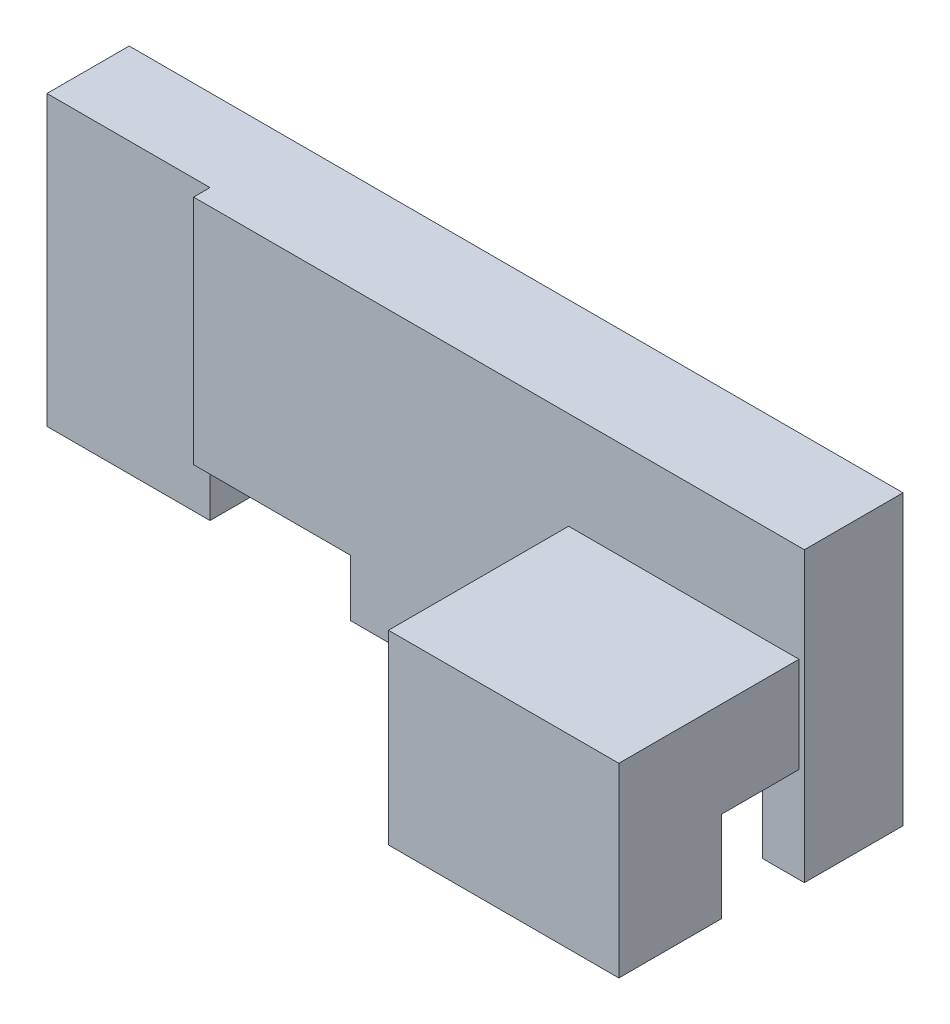
ISO-10303-21;
HEADER;
FILE_DESCRIPTION(('STEP AP214'),'2;1');
FILE_NAME('part.step','',(''),(''),'','','');
FILE_SCHEMA(('AUTOMOTIVE_DESIGN { 1 0 10303 214 1 1 1 1 }'));
ENDSEC;
DATA;
#1=APPLICATION_CONTEXT('core data for automotive mechanical design processes');
#2=APPLICATION_PROTOCOL_DEFINITION('international standard','automotive_design',2000,#1);
#3=PRODUCT_CONTEXT('',#1,'mechanical');
#4=PRODUCT('Part','Part','',(#3));
#5=PRODUCT_RELATED_PRODUCT_CATEGORY('part','',(#4));
#6=PRODUCT_DEFINITION_FORMATION('','',#4);
#7=PRODUCT_DEFINITION_CONTEXT('part definition',#1,'design');
#8=PRODUCT_DEFINITION('design','',#6,#7);
#9=PRODUCT_DEFINITION_SHAPE('','',#8);
#10=(LENGTH_UNIT() NAMED_UNIT(*) SI_UNIT(.MILLI.,.METRE.));
#11=(NAMED_UNIT(*) PLANE_ANGLE_UNIT() SI_UNIT($,.RADIAN.));
#12=(NAMED_UNIT(*) SI_UNIT($,.STERADIAN.) SOLID_ANGLE_UNIT());
#13=UNCERTAINTY_MEASURE_WITH_UNIT(LENGTH_MEASURE(1.E-05),#10,'distance_accuracy_value','');
#14=(GEOMETRIC_REPRESENTATION_CONTEXT(3) GLOBAL_UNCERTAINTY_ASSIGNED_CONTEXT((#13)) GLOBAL_UNIT_ASSIGNED_CONTEXT((#10,
#11,#12)) REPRESENTATION_CONTEXT('',''));
#15=CARTESIAN_POINT('',(0.,0.,0.));
#16=DIRECTION('',(0.,0.,1.));
#17=DIRECTION('',(1.,0.,0.));
#18=AXIS2_PLACEMENT_3D('',#15,#16,#17);
#19=CARTESIAN_POINT('',(1120.75,-651.999999999999,710.));
#20=DIRECTION('',(0.,0.,-1.));
#21=DIRECTION('',(-1.,0.,0.));
#22=AXIS2_PLACEMENT_3D('',#19,#20,#21);
#23=PLANE('',#22);
#24=DIRECTION('',(0.,1.,0.));
#25=VECTOR('',#24,1.);
#26=CARTESIAN_POINT('',(1120.75,-651.999999999999,710.));
#27=LINE('',#26,#25);
#28=CARTESIAN_POINT('',(1120.75,-651.999999999999,710.));
#29=VERTEX_POINT('',#28);
#30=CARTESIAN_POINT('',(1120.75,-316.231627321212,710.));
#31=VERTEX_POINT('',#30);
#32=EDGE_CURVE('E58',#29,#31,#27,.T.);
#33=ORIENTED_EDGE('',*,*,#32,.T.);
#34=DIRECTION('',(1.,0.,0.));
#35=VECTOR('',#34,1.);
#36=CARTESIAN_POINT('',(1120.75,-316.231627321212,710.));
#37=LINE('',#36,#35);
#38=CARTESIAN_POINT('',(1975.75,-316.231627321212,710.));
#39=VERTEX_POINT('',#38);
#40=EDGE_CURVE('E115',#31,#39,#37,.T.);
#41=ORIENTED_EDGE('',*,*,#40,.T.);
#42=DIRECTION('',(0.,1.,0.));
#43=VECTOR('',#42,1.);
#44=CARTESIAN_POINT('',(1975.75,-651.999999999999,710.));
#45=LINE('',#44,#43);
#46=CARTESIAN_POINT('',(1975.75,-651.999999999999,710.));
#47=VERTEX_POINT('',#46);
#48=EDGE_CURVE('E12',#47,#39,#45,.T.);
#49=ORIENTED_EDGE('',*,*,#48,.F.);
#50=DIRECTION('',(-1.,0.,0.));
#51=VECTOR('',#50,1.);
#52=CARTESIAN_POINT('',(1120.75,-651.999999999999,710.));
#53=LINE('',#52,#51);
#54=EDGE_CURVE('E148',#47,#29,#53,.T.);
#55=ORIENTED_EDGE('',*,*,#54,.T.);
#56=EDGE_LOOP('',(#33,#41,#49,#55));
#57=FACE_BOUND('',#56,.T.);
#58=ADVANCED_FACE('F55',(#57),#23,.T.);
#59=CARTESIAN_POINT('',(1975.75,-651.999999999999,710.));
#60=DIRECTION('',(1.,0.,0.));
#61=DIRECTION('',(0.,0.,-1.));
#62=AXIS2_PLACEMENT_3D('',#59,#60,#61);
#63=PLANE('',#62);
#64=ORIENTED_EDGE('',*,*,#48,.T.);
#65=DIRECTION('',(0.,0.,-1.));
#66=VECTOR('',#65,1.);
#67=CARTESIAN_POINT('',(1975.75,-316.231627321212,711.5));
#68=LINE('',#67,#66);
#69=CARTESIAN_POINT('',(1975.75,-316.231627321212,421.5));
#70=VERTEX_POINT('',#69);
#71=EDGE_CURVE('E119',#39,#70,#68,.T.);
#72=ORIENTED_EDGE('',*,*,#71,.T.);
#73=DIRECTION('',(0.,1.,0.));
#74=VECTOR('',#73,1.);
#75=CARTESIAN_POINT('',(1975.75,-316.231627321212,421.5));
#76=LINE('',#75,#74);
#77=CARTESIAN_POINT('',(1975.75,38.0000000000002,421.5));
#78=VERTEX_POINT('',#77);
#79=EDGE_CURVE('E127',#70,#78,#76,.T.);
#80=ORIENTED_EDGE('',*,*,#79,.T.);
#81=DIRECTION('',(0.,0.,-1.));
#82=VECTOR('',#81,1.);
#83=CARTESIAN_POINT('',(1975.75,38.0000000000002,710.));
#84=LINE('',#83,#82);
#85=CARTESIAN_POINT('',(1975.75,38.0000000000002,1090.));
#86=VERTEX_POINT('',#85);
#87=EDGE_CURVE('E145',#86,#78,#84,.T.);
#88=ORIENTED_EDGE('',*,*,#87,.F.);
#89=DIRECTION('',(0.,1.,0.));
#90=VECTOR('',#89,1.);
#91=CARTESIAN_POINT('',(1975.75,-651.999999999999,1090.));
#92=LINE('',#91,#90);
#93=CARTESIAN_POINT('',(1975.75,-651.999999999999,1090.));
#94=VERTEX_POINT('',#93);
#95=EDGE_CURVE('E63',#94,#86,#92,.T.);
#96=ORIENTED_EDGE('',*,*,#95,.F.);
#97=DIRECTION('',(0.,0.,-1.));
#98=VECTOR('',#97,1.);
#99=CARTESIAN_POINT('',(1975.75,-651.999999999999,710.));
#100=LINE('',#99,#98);
#101=EDGE_CURVE('E157',#94,#47,#100,.T.);
#102=ORIENTED_EDGE('',*,*,#101,.T.);
#103=EDGE_LOOP('',(#64,#72,#80,#88,#96,#102));
#104=FACE_BOUND('',#103,.T.);
#105=ADVANCED_FACE('F171',(#104),#63,.T.);
#106=CARTESIAN_POINT('',(1975.75,-651.999999999999,1090.));
#107=DIRECTION('',(0.,0.,1.));
#108=DIRECTION('',(1.,0.,0.));
#109=AXIS2_PLACEMENT_3D('',#106,#107,#108);
#110=PLANE('',#109);
#111=ORIENTED_EDGE('',*,*,#95,.T.);
#112=DIRECTION('',(1.,0.,0.));
#113=VECTOR('',#112,1.);
#114=CARTESIAN_POINT('',(1975.75,38.0000000000002,1090.));
#115=LINE('',#114,#113);
#116=CARTESIAN_POINT('',(1120.75,38.0000000000002,1090.));
#117=VERTEX_POINT('',#116);
#118=EDGE_CURVE('E142',#117,#86,#115,.T.);
#119=ORIENTED_EDGE('',*,*,#118,.F.);
#120=DIRECTION('',(0.,1.,0.));
#121=VECTOR('',#120,1.);
#122=CARTESIAN_POINT('',(1120.75,-651.999999999999,1090.));
#123=LINE('',#122,#121);
#124=CARTESIAN_POINT('',(1120.75,-651.999999999999,1090.));
#125=VERTEX_POINT('',#124);
#126=EDGE_CURVE('E159',#125,#117,#123,.T.);
#127=ORIENTED_EDGE('',*,*,#126,.F.);
#128=DIRECTION('',(1.,0.,0.));
#129=VECTOR('',#128,1.);
#130=CARTESIAN_POINT('',(1975.75,-651.999999999999,1090.));
#131=LINE('',#130,#129);
#132=EDGE_CURVE('E155',#125,#94,#131,.T.);
#133=ORIENTED_EDGE('',*,*,#132,.T.);
#134=EDGE_LOOP('',(#111,#119,#127,#133));
#135=FACE_BOUND('',#134,.T.);
#136=ADVANCED_FACE('F168',(#135),#110,.T.);
#137=CARTESIAN_POINT('',(1120.75,-651.999999999999,1090.));
#138=DIRECTION('',(-1.,0.,0.));
#139=DIRECTION('',(0.,0.,1.));
#140=AXIS2_PLACEMENT_3D('',#137,#138,#139);
#141=PLANE('',#140);
#142=DIRECTION('',(0.,0.,1.));
#143=VECTOR('',#142,1.);
#144=CARTESIAN_POINT('',(1120.75,38.0000000000002,1090.));
#145=LINE('',#144,#143);
#146=CARTESIAN_POINT('',(1120.75,38.0000000000002,421.5));
#147=VERTEX_POINT('',#146);
#148=EDGE_CURVE('E131',#147,#117,#145,.T.);
#149=ORIENTED_EDGE('',*,*,#148,.F.);
#150=DIRECTION('',(0.,-1.,0.));
#151=VECTOR('',#150,1.);
#152=CARTESIAN_POINT('',(1120.75,-316.231627321212,421.5));
#153=LINE('',#152,#151);
#154=CARTESIAN_POINT('',(1120.75,-316.231627321212,421.5));
#155=VERTEX_POINT('',#154);
#156=EDGE_CURVE('E125',#147,#155,#153,.T.);
#157=ORIENTED_EDGE('',*,*,#156,.T.);
#158=DIRECTION('',(0.,0.,-1.));
#159=VECTOR('',#158,1.);
#160=CARTESIAN_POINT('',(1120.75,-316.231627321212,711.5));
#161=LINE('',#160,#159);
#162=EDGE_CURVE('E110',#31,#155,#161,.T.);
#163=ORIENTED_EDGE('',*,*,#162,.F.);
#164=ORIENTED_EDGE('',*,*,#32,.F.);
#165=DIRECTION('',(0.,0.,1.));
#166=VECTOR('',#165,1.);
#167=CARTESIAN_POINT('',(1120.75,-651.999999999999,1090.));
#168=LINE('',#167,#166);
#169=EDGE_CURVE('E151',#29,#125,#168,.T.);
#170=ORIENTED_EDGE('',*,*,#169,.T.);
#171=ORIENTED_EDGE('',*,*,#126,.T.);
#172=EDGE_LOOP('',(#149,#157,#163,#164,#170,#171));
#173=FACE_BOUND('',#172,.T.);
#174=ADVANCED_FACE('F129',(#173),#141,.T.);
#175=CARTESIAN_POINT('',(0.,-651.999999999999,0.));
#176=DIRECTION('',(0.,-1.,0.));
#177=DIRECTION('',(0.,0.,-1.));
#178=AXIS2_PLACEMENT_3D('',#175,#176,#177);
#179=PLANE('',#178);
#180=ORIENTED_EDGE('',*,*,#54,.F.);
#181=ORIENTED_EDGE('',*,*,#101,.F.);
#182=ORIENTED_EDGE('',*,*,#132,.F.);
#183=ORIENTED_EDGE('',*,*,#169,.F.);
#184=EDGE_LOOP('',(#180,#181,#182,#183));
#185=FACE_BOUND('',#184,.T.);
#186=ADVANCED_FACE('F165',(#185),#179,.T.);
#187=CARTESIAN_POINT('',(0.,38.0000000000002,0.));
#188=DIRECTION('',(0.,-1.,0.));
#189=DIRECTION('',(0.,0.,-1.));
#190=AXIS2_PLACEMENT_3D('',#187,#188,#189);
#191=PLANE('',#190);
#192=ORIENTED_EDGE('',*,*,#148,.T.);
#193=ORIENTED_EDGE('',*,*,#118,.T.);
#194=ORIENTED_EDGE('',*,*,#87,.T.);
#195=DIRECTION('',(-1.,0.,0.));
#196=VECTOR('',#195,1.);
#197=CARTESIAN_POINT('',(1120.75,38.0000000000002,421.5));
#198=LINE('',#197,#196);
#199=EDGE_CURVE('E136',#78,#147,#198,.T.);
#200=ORIENTED_EDGE('',*,*,#199,.T.);
#201=EDGE_LOOP('',(#192,#193,#194,#200));
#202=FACE_BOUND('',#201,.T.);
#203=ADVANCED_FACE('F170',(#202),#191,.F.);
#204=CARTESIAN_POINT('',(1120.75,-316.231627321212,711.5));
#205=DIRECTION('',(0.,1.,0.));
#206=DIRECTION('',(0.,0.,1.));
#207=AXIS2_PLACEMENT_3D('',#204,#205,#206);
#208=PLANE('',#207);
#209=ORIENTED_EDGE('',*,*,#40,.F.);
#210=ORIENTED_EDGE('',*,*,#162,.T.);
#211=DIRECTION('',(1.,0.,0.));
#212=VECTOR('',#211,1.);
#213=CARTESIAN_POINT('',(1120.75,-316.231627321212,421.5));
#214=LINE('',#213,#212);
#215=EDGE_CURVE('E113',#155,#70,#214,.T.);
#216=ORIENTED_EDGE('',*,*,#215,.T.);
#217=ORIENTED_EDGE('',*,*,#71,.F.);
#218=EDGE_LOOP('',(#209,#210,#216,#217));
#219=FACE_BOUND('',#218,.T.);
#220=ADVANCED_FACE('F112',(#219),#208,.F.);
#221=CARTESIAN_POINT('',(0.,0.,421.5));
#222=DIRECTION('',(0.,0.,-1.));
#223=DIRECTION('',(-1.,0.,0.));
#224=AXIS2_PLACEMENT_3D('',#221,#222,#223);
#225=PLANE('',#224);
#226=ORIENTED_EDGE('',*,*,#156,.F.);
#227=ORIENTED_EDGE('',*,*,#199,.F.);
#228=ORIENTED_EDGE('',*,*,#79,.F.);
#229=ORIENTED_EDGE('',*,*,#215,.F.);
#230=EDGE_LOOP('',(#226,#227,#228,#229));
#231=FACE_BOUND('',#230,.T.);
#232=ADVANCED_FACE('F123',(#231),#225,.T.);
#233=CLOSED_SHELL('',(#58,#105,#136,#174,#186,#203,#220,#232));
#234=MANIFOLD_SOLID_BREP('B2',#233);
#235=CARTESIAN_POINT('',(0.,-480.,0.));
#236=DIRECTION('',(0.,1.,0.));
#237=DIRECTION('',(0.,0.,1.));
#238=AXIS2_PLACEMENT_3D('',#235,#236,#237);
#239=PLANE('',#238);
#240=DIRECTION('',(0.,0.,1.));
#241=VECTOR('',#240,1.);
#242=CARTESIAN_POINT('',(290.750000000005,-480.,205.75));
#243=LINE('',#242,#241);
#244=CARTESIAN_POINT('',(290.750000000005,-480.,35.5427020640417));
#245=VERTEX_POINT('',#244);
#246=CARTESIAN_POINT('',(290.750000000005,-480.,401.5));
#247=VERTEX_POINT('',#246);
#248=EDGE_CURVE('E381',#245,#247,#243,.T.);
#249=ORIENTED_EDGE('',*,*,#248,.T.);
#250=DIRECTION('',(1.,0.,0.));
#251=VECTOR('',#250,1.);
#252=CARTESIAN_POINT('',(-290.749999999998,-480.,401.5));
#253=LINE('',#252,#251);
#254=CARTESIAN_POINT('',(-290.749999999998,-480.,401.5));
#255=VERTEX_POINT('',#254);
#256=EDGE_CURVE('E359',#255,#247,#253,.T.);
#257=ORIENTED_EDGE('',*,*,#256,.F.);
#258=DIRECTION('',(0.,0.,1.));
#259=VECTOR('',#258,1.);
#260=CARTESIAN_POINT('',(-290.749999999998,-480.,340.542702064042));
#261=LINE('',#260,#259);
#262=CARTESIAN_POINT('',(-290.749999999998,-480.,340.542702064042));
#263=VERTEX_POINT('',#262);
#264=EDGE_CURVE('E363',#263,#255,#261,.T.);
#265=ORIENTED_EDGE('',*,*,#264,.F.);
#266=DIRECTION('',(0.,0.,-1.));
#267=VECTOR('',#266,1.);
#268=CARTESIAN_POINT('',(-290.749999999998,-480.,340.542702064042));
#269=LINE('',#268,#267);
#270=CARTESIAN_POINT('',(-290.749999999999,-480.,35.5427020640419));
#271=VERTEX_POINT('',#270);
#272=EDGE_CURVE('E316',#263,#271,#269,.T.);
#273=ORIENTED_EDGE('',*,*,#272,.T.);
#274=DIRECTION('',(-1.,0.,0.));
#275=VECTOR('',#274,1.);
#276=CARTESIAN_POINT('',(1975.75,-480.,35.5427020640417));
#277=LINE('',#276,#275);
#278=EDGE_CURVE('E356',#245,#271,#277,.T.);
#279=ORIENTED_EDGE('',*,*,#278,.F.);
#280=EDGE_LOOP('',(#249,#257,#265,#273,#279));
#281=FACE_BOUND('',#280,.T.);
#282=ADVANCED_FACE('F249',(#281),#239,.F.);
#283=CARTESIAN_POINT('',(-290.749999999998,-480.,205.750000000001));
#284=DIRECTION('',(-1.,0.,0.));
#285=DIRECTION('',(0.,0.,1.));
#286=AXIS2_PLACEMENT_3D('',#283,#284,#285);
#287=PLANE('',#286);
#288=DIRECTION('',(0.,0.,-1.));
#289=VECTOR('',#288,1.);
#290=CARTESIAN_POINT('',(-290.749999999998,-690.,205.750000000001));
#291=LINE('',#290,#289);
#292=CARTESIAN_POINT('',(-290.749999999998,-690.,340.542702064042));
#293=VERTEX_POINT('',#292);
#294=CARTESIAN_POINT('',(-290.749999999998,-690.,35.5427020640419));
#295=VERTEX_POINT('',#294);
#296=EDGE_CURVE('E315',#293,#295,#291,.T.);
#297=ORIENTED_EDGE('',*,*,#296,.T.);
#298=DIRECTION('',(0.,-1.,0.));
#299=VECTOR('',#298,1.);
#300=CARTESIAN_POINT('',(-290.749999999998,-480.,35.5427020640419));
#301=LINE('',#300,#299);
#302=EDGE_CURVE('E326',#271,#295,#301,.T.);
#303=ORIENTED_EDGE('',*,*,#302,.F.);
#304=ORIENTED_EDGE('',*,*,#272,.F.);
#305=DIRECTION('',(0.,-1.,0.));
#306=VECTOR('',#305,1.);
#307=CARTESIAN_POINT('',(-290.749999999998,-480.,340.542702064042));
#308=LINE('',#307,#306);
#309=EDGE_CURVE('E274',#263,#293,#308,.T.);
#310=ORIENTED_EDGE('',*,*,#309,.T.);
#311=EDGE_LOOP('',(#297,#303,#304,#310));
#312=FACE_BOUND('',#311,.T.);
#313=ADVANCED_FACE('F251',(#312),#287,.F.);
#314=CARTESIAN_POINT('',(-290.749999999998,-480.,35.5427020640419));
#315=DIRECTION('',(0.,0.,1.));
#316=DIRECTION('',(1.,0.,0.));
#317=AXIS2_PLACEMENT_3D('',#314,#315,#316);
#318=PLANE('',#317);
#319=DIRECTION('',(0.,1.,0.));
#320=VECTOR('',#319,1.);
#321=CARTESIAN_POINT('',(-205.749999999998,-480.,35.5427020640419));
#322=LINE('',#321,#320);
#323=CARTESIAN_POINT('',(-205.749999999998,-255.000000000006,35.5427020640419));
#324=VERTEX_POINT('',#323);
#325=CARTESIAN_POINT('',(-205.749999999998,254.999999999994,35.5427020640419));
#326=VERTEX_POINT('',#325);
#327=EDGE_CURVE('E53',#324,#326,#322,.T.);
#328=ORIENTED_EDGE('',*,*,#327,.T.);
#329=DIRECTION('',(-1.,0.,0.));
#330=VECTOR('',#329,1.);
#331=CARTESIAN_POINT('',(-290.749999999998,254.999999999994,35.5427020640419));
#332=LINE('',#331,#330);
#333=CARTESIAN_POINT('',(-895.749999999998,254.999999999994,35.5427020640419));
#334=VERTEX_POINT('',#333);
#335=EDGE_CURVE('E441',#326,#334,#332,.T.);
#336=ORIENTED_EDGE('',*,*,#335,.T.);
#337=DIRECTION('',(0.,-1.,0.));
#338=VECTOR('',#337,1.);
#339=CARTESIAN_POINT('',(-895.749999999998,-480.,35.5427020640419));
#340=LINE('',#339,#338);
#341=CARTESIAN_POINT('',(-895.749999999998,380.000000000001,35.5427020640419));
#342=VERTEX_POINT('',#341);
#343=EDGE_CURVE('E324',#342,#334,#340,.T.);
#344=ORIENTED_EDGE('',*,*,#343,.F.);
#345=DIRECTION('',(-1.,0.,0.));
#346=VECTOR('',#345,1.);
#347=CARTESIAN_POINT('',(1975.75,380.000000000001,35.5427020640417));
#348=LINE('',#347,#346);
#349=CARTESIAN_POINT('',(1975.75,380.000000000001,35.5427020640417));
#350=VERTEX_POINT('',#349);
#351=EDGE_CURVE('E355',#350,#342,#348,.T.);
#352=ORIENTED_EDGE('',*,*,#351,.F.);
#353=DIRECTION('',(0.,-1.,0.));
#354=VECTOR('',#353,1.);
#355=CARTESIAN_POINT('',(1975.75,380.000000000001,35.5427020640417));
#356=LINE('',#355,#354);
#357=CARTESIAN_POINT('',(1975.75,-690.,35.5427020640419));
#358=VERTEX_POINT('',#357);
#359=EDGE_CURVE('E352',#350,#358,#356,.T.);
#360=ORIENTED_EDGE('',*,*,#359,.T.);
#361=DIRECTION('',(-1.,0.,0.));
#362=VECTOR('',#361,1.);
#363=CARTESIAN_POINT('',(1975.75,-690.,35.5427020640419));
#364=LINE('',#363,#362);
#365=CARTESIAN_POINT('',(1820.75,-690.,35.5427020640417));
#366=VERTEX_POINT('',#365);
#367=EDGE_CURVE('E417',#358,#366,#364,.T.);
#368=ORIENTED_EDGE('',*,*,#367,.T.);
#369=DIRECTION('',(0.,-1.,0.));
#370=VECTOR('',#369,1.);
#371=CARTESIAN_POINT('',(1820.75,-480.,35.5427020640417));
#372=LINE('',#371,#370);
#373=CARTESIAN_POINT('',(1820.75,-457.3,35.5427020640419));
#374=VERTEX_POINT('',#373);
#375=EDGE_CURVE('E423',#374,#366,#372,.T.);
#376=ORIENTED_EDGE('',*,*,#375,.F.);
#377=DIRECTION('',(-1.,0.,0.));
#378=VECTOR('',#377,1.);
#379=CARTESIAN_POINT('',(-290.749999999998,-457.3,35.5427020640419));
#380=LINE('',#379,#378);
#381=CARTESIAN_POINT('',(1239.25,-457.3,35.5427020640419));
#382=VERTEX_POINT('',#381);
#383=EDGE_CURVE('E429',#374,#382,#380,.T.);
#384=ORIENTED_EDGE('',*,*,#383,.T.);
#385=DIRECTION('',(0.,-1.,0.));
#386=VECTOR('',#385,1.);
#387=CARTESIAN_POINT('',(1239.25,-480.,35.5427020640419));
#388=LINE('',#387,#386);
#389=CARTESIAN_POINT('',(1239.25,-690.,35.5427020640419));
#390=VERTEX_POINT('',#389);
#391=EDGE_CURVE('E401',#382,#390,#388,.T.);
#392=ORIENTED_EDGE('',*,*,#391,.T.);
#393=DIRECTION('',(-1.,0.,0.));
#394=VECTOR('',#393,1.);
#395=CARTESIAN_POINT('',(1239.25,-690.,35.5427020640419));
#396=LINE('',#395,#394);
#397=CARTESIAN_POINT('',(290.750000000005,-690.,35.5427020640417));
#398=VERTEX_POINT('',#397);
#399=EDGE_CURVE('E393',#390,#398,#396,.T.);
#400=ORIENTED_EDGE('',*,*,#399,.T.);
#401=DIRECTION('',(0.,-1.,0.));
#402=VECTOR('',#401,1.);
#403=CARTESIAN_POINT('',(290.750000000005,-480.,35.5427020640417));
#404=LINE('',#403,#402);
#405=EDGE_CURVE('E386',#245,#398,#404,.T.);
#406=ORIENTED_EDGE('',*,*,#405,.F.);
#407=ORIENTED_EDGE('',*,*,#278,.T.);
#408=ORIENTED_EDGE('',*,*,#302,.T.);
#409=DIRECTION('',(-1.,0.,0.));
#410=VECTOR('',#409,1.);
#411=CARTESIAN_POINT('',(-290.749999999998,-690.,35.5427020640419));
#412=LINE('',#411,#410);
#413=CARTESIAN_POINT('',(-895.749999999998,-690.,35.5427020640419));
#414=VERTEX_POINT('',#413);
#415=EDGE_CURVE('E307',#295,#414,#412,.T.);
#416=ORIENTED_EDGE('',*,*,#415,.T.);
#417=CARTESIAN_POINT('',(-895.749999999998,-255.000000000006,35.5427020640419));
#418=VERTEX_POINT('',#417);
#419=EDGE_CURVE('E301',#418,#414,#340,.T.);
#420=ORIENTED_EDGE('',*,*,#419,.F.);
#421=DIRECTION('',(1.,0.,0.));
#422=VECTOR('',#421,1.);
#423=CARTESIAN_POINT('',(-290.749999999998,-255.000000000006,35.5427020640419));
#424=LINE('',#423,#422);
#425=EDGE_CURVE('E265',#418,#324,#424,.T.);
#426=ORIENTED_EDGE('',*,*,#425,.T.);
#427=EDGE_LOOP('',(#328,#336,#344,#352,#360,#368,#376,#384,#392,#400,#406,#407,#408,#416,#420,#426));
#428=FACE_BOUND('',#427,.T.);
#429=ADVANCED_FACE('F336',(#428),#318,.F.);
#430=CARTESIAN_POINT('',(-895.749999999998,-480.,35.5427020640419));
#431=DIRECTION('',(1.,0.,0.));
#432=DIRECTION('',(0.,0.,-1.));
#433=AXIS2_PLACEMENT_3D('',#430,#431,#432);
#434=PLANE('',#433);
#435=ORIENTED_EDGE('',*,*,#343,.T.);
#436=DIRECTION('',(0.,0.,-1.));
#437=VECTOR('',#436,1.);
#438=CARTESIAN_POINT('',(-895.749999999998,254.999999999994,2.84426398644748E-13));
#439=LINE('',#438,#437);
#440=CARTESIAN_POINT('',(-895.749999999998,254.999999999994,85.0000000000003));
#441=VERTEX_POINT('',#440);
#442=EDGE_CURVE('E454',#441,#334,#439,.T.);
#443=ORIENTED_EDGE('',*,*,#442,.F.);
#444=DIRECTION('',(0.,1.,0.));
#445=VECTOR('',#444,1.);
#446=CARTESIAN_POINT('',(-895.749999999998,254.999999999994,85.0000000000003));
#447=LINE('',#446,#445);
#448=CARTESIAN_POINT('',(-895.749999999998,-255.000000000006,85.0000000000003));
#449=VERTEX_POINT('',#448);
#450=EDGE_CURVE('E332',#449,#441,#447,.T.);
#451=ORIENTED_EDGE('',*,*,#450,.F.);
#452=DIRECTION('',(0.,0.,-1.));
#453=VECTOR('',#452,1.);
#454=CARTESIAN_POINT('',(-895.749999999998,-255.000000000006,35.5427020640419));
#455=LINE('',#454,#453);
#456=EDGE_CURVE('E258',#449,#418,#455,.T.);
#457=ORIENTED_EDGE('',*,*,#456,.T.);
#458=ORIENTED_EDGE('',*,*,#419,.T.);
#459=DIRECTION('',(0.,0.,1.));
#460=VECTOR('',#459,1.);
#461=CARTESIAN_POINT('',(-895.749999999998,-690.,35.5427020640419));
#462=LINE('',#461,#460);
#463=CARTESIAN_POINT('',(-895.749999999998,-690.,340.542702064042));
#464=VERTEX_POINT('',#463);
#465=EDGE_CURVE('E292',#414,#464,#462,.T.);
#466=ORIENTED_EDGE('',*,*,#465,.T.);
#467=DIRECTION('',(0.,-1.,0.));
#468=VECTOR('',#467,1.);
#469=CARTESIAN_POINT('',(-895.749999999998,-480.,340.542702064042));
#470=LINE('',#469,#468);
#471=CARTESIAN_POINT('',(-895.749999999998,380.000000000001,340.542702064042));
#472=VERTEX_POINT('',#471);
#473=EDGE_CURVE('E298',#472,#464,#470,.T.);
#474=ORIENTED_EDGE('',*,*,#473,.F.);
#475=DIRECTION('',(0.,0.,1.));
#476=VECTOR('',#475,1.);
#477=CARTESIAN_POINT('',(-895.749999999998,380.000000000001,35.5427020640419));
#478=LINE('',#477,#476);
#479=EDGE_CURVE('E358',#342,#472,#478,.T.);
#480=ORIENTED_EDGE('',*,*,#479,.F.);
#481=EDGE_LOOP('',(#435,#443,#451,#457,#458,#466,#474,#480));
#482=FACE_BOUND('',#481,.T.);
#483=ADVANCED_FACE('F295',(#482),#434,.F.);
#484=CARTESIAN_POINT('',(-895.749999999998,-480.,340.542702064042));
#485=DIRECTION('',(0.,0.,-1.));
#486=DIRECTION('',(-1.,0.,0.));
#487=AXIS2_PLACEMENT_3D('',#484,#485,#486);
#488=PLANE('',#487);
#489=DIRECTION('',(1.,0.,0.));
#490=VECTOR('',#489,1.);
#491=CARTESIAN_POINT('',(-895.749999999998,-690.,340.542702064042));
#492=LINE('',#491,#490);
#493=EDGE_CURVE('E306',#464,#293,#492,.T.);
#494=ORIENTED_EDGE('',*,*,#493,.T.);
#495=ORIENTED_EDGE('',*,*,#309,.F.);
#496=DIRECTION('',(0.,-1.,0.));
#497=VECTOR('',#496,1.);
#498=CARTESIAN_POINT('',(-290.749999999998,380.000000000001,340.542702064042));
#499=LINE('',#498,#497);
#500=CARTESIAN_POINT('',(-290.749999999998,380.000000000001,340.542702064042));
#501=VERTEX_POINT('',#500);
#502=EDGE_CURVE('E341',#501,#263,#499,.T.);
#503=ORIENTED_EDGE('',*,*,#502,.F.);
#504=DIRECTION('',(1.,0.,0.));
#505=VECTOR('',#504,1.);
#506=CARTESIAN_POINT('',(-895.749999999998,380.000000000001,340.542702064042));
#507=LINE('',#506,#505);
#508=EDGE_CURVE('E311',#472,#501,#507,.T.);
#509=ORIENTED_EDGE('',*,*,#508,.F.);
#510=ORIENTED_EDGE('',*,*,#473,.T.);
#511=EDGE_LOOP('',(#494,#495,#503,#509,#510));
#512=FACE_BOUND('',#511,.T.);
#513=ADVANCED_FACE('F309',(#512),#488,.F.);
#514=CARTESIAN_POINT('',(0.,-690.,0.));
#515=DIRECTION('',(0.,1.,0.));
#516=DIRECTION('',(0.,0.,1.));
#517=AXIS2_PLACEMENT_3D('',#514,#515,#516);
#518=PLANE('',#517);
#519=ORIENTED_EDGE('',*,*,#296,.F.);
#520=ORIENTED_EDGE('',*,*,#493,.F.);
#521=ORIENTED_EDGE('',*,*,#465,.F.);
#522=ORIENTED_EDGE('',*,*,#415,.F.);
#523=EDGE_LOOP('',(#519,#520,#521,#522));
#524=FACE_BOUND('',#523,.T.);
#525=ADVANCED_FACE('F314',(#524),#518,.F.);
#526=CARTESIAN_POINT('',(-290.749999999998,380.000000000001,340.542702064042));
#527=DIRECTION('',(1.,0.,0.));
#528=DIRECTION('',(0.,0.,-1.));
#529=AXIS2_PLACEMENT_3D('',#526,#527,#528);
#530=PLANE('',#529);
#531=ORIENTED_EDGE('',*,*,#264,.T.);
#532=DIRECTION('',(0.,-1.,0.));
#533=VECTOR('',#532,1.);
#534=CARTESIAN_POINT('',(-290.749999999998,380.000000000001,401.5));
#535=LINE('',#534,#533);
#536=CARTESIAN_POINT('',(-290.749999999998,380.000000000001,401.5));
#537=VERTEX_POINT('',#536);
#538=EDGE_CURVE('E346',#537,#255,#535,.T.);
#539=ORIENTED_EDGE('',*,*,#538,.F.);
#540=DIRECTION('',(0.,0.,1.));
#541=VECTOR('',#540,1.);
#542=CARTESIAN_POINT('',(-290.749999999998,380.000000000001,340.542702064042));
#543=LINE('',#542,#541);
#544=EDGE_CURVE('E376',#501,#537,#543,.T.);
#545=ORIENTED_EDGE('',*,*,#544,.F.);
#546=ORIENTED_EDGE('',*,*,#502,.T.);
#547=EDGE_LOOP('',(#531,#539,#545,#546));
#548=FACE_BOUND('',#547,.T.);
#549=ADVANCED_FACE('F547',(#548),#530,.F.);
#550=CARTESIAN_POINT('',(-290.749999999998,380.000000000001,401.5));
#551=DIRECTION('',(0.,0.,-1.));
#552=DIRECTION('',(-1.,0.,0.));
#553=AXIS2_PLACEMENT_3D('',#550,#551,#552);
#554=PLANE('',#553);
#555=DIRECTION('',(0.,-1.,0.));
#556=VECTOR('',#555,1.);
#557=CARTESIAN_POINT('',(1239.25,-480.,401.5));
#558=LINE('',#557,#556);
#559=CARTESIAN_POINT('',(1239.25,-457.3,401.5));
#560=VERTEX_POINT('',#559);
#561=CARTESIAN_POINT('',(1239.25,-690.,401.5));
#562=VERTEX_POINT('',#561);
#563=EDGE_CURVE('E404',#560,#562,#558,.T.);
#564=ORIENTED_EDGE('',*,*,#563,.F.);
#565=DIRECTION('',(-1.,0.,0.));
#566=VECTOR('',#565,1.);
#567=CARTESIAN_POINT('',(1239.25,-457.3,401.5));
#568=LINE('',#567,#566);
#569=CARTESIAN_POINT('',(1820.75,-457.3,401.5));
#570=VERTEX_POINT('',#569);
#571=EDGE_CURVE('E436',#570,#560,#568,.T.);
#572=ORIENTED_EDGE('',*,*,#571,.F.);
#573=DIRECTION('',(0.,-1.,0.));
#574=VECTOR('',#573,1.);
#575=CARTESIAN_POINT('',(1820.75,-480.,401.5));
#576=LINE('',#575,#574);
#577=CARTESIAN_POINT('',(1820.75,-690.,401.5));
#578=VERTEX_POINT('',#577);
#579=EDGE_CURVE('E426',#570,#578,#576,.T.);
#580=ORIENTED_EDGE('',*,*,#579,.T.);
#581=DIRECTION('',(1.,0.,0.));
#582=VECTOR('',#581,1.);
#583=CARTESIAN_POINT('',(1820.75,-690.,401.5));
#584=LINE('',#583,#582);
#585=CARTESIAN_POINT('',(1975.75,-690.,401.5));
#586=VERTEX_POINT('',#585);
#587=EDGE_CURVE('E411',#578,#586,#584,.T.);
#588=ORIENTED_EDGE('',*,*,#587,.T.);
#589=DIRECTION('',(0.,-1.,0.));
#590=VECTOR('',#589,1.);
#591=CARTESIAN_POINT('',(1975.75,380.000000000001,401.5));
#592=LINE('',#591,#590);
#593=CARTESIAN_POINT('',(1975.75,380.000000000001,401.5));
#594=VERTEX_POINT('',#593);
#595=EDGE_CURVE('E349',#594,#586,#592,.T.);
#596=ORIENTED_EDGE('',*,*,#595,.F.);
#597=DIRECTION('',(1.,0.,0.));
#598=VECTOR('',#597,1.);
#599=CARTESIAN_POINT('',(-290.749999999998,380.000000000001,401.5));
#600=LINE('',#599,#598);
#601=EDGE_CURVE('E373',#537,#594,#600,.T.);
#602=ORIENTED_EDGE('',*,*,#601,.F.);
#603=ORIENTED_EDGE('',*,*,#538,.T.);
#604=ORIENTED_EDGE('',*,*,#256,.T.);
#605=DIRECTION('',(0.,-1.,0.));
#606=VECTOR('',#605,1.);
#607=CARTESIAN_POINT('',(290.750000000005,-480.,401.5));
#608=LINE('',#607,#606);
#609=CARTESIAN_POINT('',(290.750000000005,-690.,401.5));
#610=VERTEX_POINT('',#609);
#611=EDGE_CURVE('E407',#247,#610,#608,.T.);
#612=ORIENTED_EDGE('',*,*,#611,.T.);
#613=DIRECTION('',(1.,0.,0.));
#614=VECTOR('',#613,1.);
#615=CARTESIAN_POINT('',(290.750000000005,-690.,401.5));
#616=LINE('',#615,#614);
#617=EDGE_CURVE('E366',#610,#562,#616,.T.);
#618=ORIENTED_EDGE('',*,*,#617,.T.);
#619=EDGE_LOOP('',(#564,#572,#580,#588,#596,#602,#603,#604,#612,#618));
#620=FACE_BOUND('',#619,.T.);
#621=ADVANCED_FACE('F553',(#620),#554,.F.);
#622=CARTESIAN_POINT('',(1975.75,380.000000000001,401.5));
#623=DIRECTION('',(-1.,0.,0.));
#624=DIRECTION('',(0.,0.,1.));
#625=AXIS2_PLACEMENT_3D('',#622,#623,#624);
#626=PLANE('',#625);
#627=ORIENTED_EDGE('',*,*,#595,.T.);
#628=DIRECTION('',(0.,0.,-1.));
#629=VECTOR('',#628,1.);
#630=CARTESIAN_POINT('',(1975.75,-690.,401.5));
#631=LINE('',#630,#629);
#632=EDGE_CURVE('E414',#586,#358,#631,.T.);
#633=ORIENTED_EDGE('',*,*,#632,.T.);
#634=ORIENTED_EDGE('',*,*,#359,.F.);
#635=DIRECTION('',(0.,0.,-1.));
#636=VECTOR('',#635,1.);
#637=CARTESIAN_POINT('',(1975.75,380.000000000001,401.5));
#638=LINE('',#637,#636);
#639=EDGE_CURVE('E370',#594,#350,#638,.T.);
#640=ORIENTED_EDGE('',*,*,#639,.F.);
#641=EDGE_LOOP('',(#627,#633,#634,#640));
#642=FACE_BOUND('',#641,.T.);
#643=ADVANCED_FACE('F582',(#642),#626,.F.);
#644=CARTESIAN_POINT('',(0.,380.000000000001,0.));
#645=DIRECTION('',(0.,1.,0.));
#646=DIRECTION('',(0.,0.,1.));
#647=AXIS2_PLACEMENT_3D('',#644,#645,#646);
#648=PLANE('',#647);
#649=ORIENTED_EDGE('',*,*,#479,.T.);
#650=ORIENTED_EDGE('',*,*,#508,.T.);
#651=ORIENTED_EDGE('',*,*,#544,.T.);
#652=ORIENTED_EDGE('',*,*,#601,.T.);
#653=ORIENTED_EDGE('',*,*,#639,.T.);
#654=ORIENTED_EDGE('',*,*,#351,.T.);
#655=EDGE_LOOP('',(#649,#650,#651,#652,#653,#654));
#656=FACE_BOUND('',#655,.T.);
#657=ADVANCED_FACE('F586',(#656),#648,.T.);
#658=CARTESIAN_POINT('',(1239.25,-480.,205.75));
#659=DIRECTION('',(-1.,0.,0.));
#660=DIRECTION('',(0.,0.,1.));
#661=AXIS2_PLACEMENT_3D('',#658,#659,#660);
#662=PLANE('',#661);
#663=DIRECTION('',(0.,0.,-1.));
#664=VECTOR('',#663,1.);
#665=CARTESIAN_POINT('',(1239.25,-690.,205.75));
#666=LINE('',#665,#664);
#667=EDGE_CURVE('E390',#562,#390,#666,.T.);
#668=ORIENTED_EDGE('',*,*,#667,.T.);
#669=ORIENTED_EDGE('',*,*,#391,.F.);
#670=DIRECTION('',(0.,0.,1.));
#671=VECTOR('',#670,1.);
#672=CARTESIAN_POINT('',(1239.25,-457.3,-68.5));
#673=LINE('',#672,#671);
#674=EDGE_CURVE('E432',#382,#560,#673,.T.);
#675=ORIENTED_EDGE('',*,*,#674,.T.);
#676=ORIENTED_EDGE('',*,*,#563,.T.);
#677=EDGE_LOOP('',(#668,#669,#675,#676));
#678=FACE_BOUND('',#677,.T.);
#679=ADVANCED_FACE('F566',(#678),#662,.F.);
#680=CARTESIAN_POINT('',(290.750000000005,-480.,205.75));
#681=DIRECTION('',(1.,0.,0.));
#682=DIRECTION('',(0.,0.,-1.));
#683=AXIS2_PLACEMENT_3D('',#680,#681,#682);
#684=PLANE('',#683);
#685=DIRECTION('',(0.,0.,1.));
#686=VECTOR('',#685,1.);
#687=CARTESIAN_POINT('',(290.750000000005,-690.,205.75));
#688=LINE('',#687,#686);
#689=EDGE_CURVE('E385',#398,#610,#688,.T.);
#690=ORIENTED_EDGE('',*,*,#689,.T.);
#691=ORIENTED_EDGE('',*,*,#611,.F.);
#692=ORIENTED_EDGE('',*,*,#248,.F.);
#693=ORIENTED_EDGE('',*,*,#405,.T.);
#694=EDGE_LOOP('',(#690,#691,#692,#693));
#695=FACE_BOUND('',#694,.T.);
#696=ADVANCED_FACE('F558',(#695),#684,.F.);
#697=CARTESIAN_POINT('',(0.,-690.,0.));
#698=DIRECTION('',(0.,1.,0.));
#699=DIRECTION('',(0.,0.,1.));
#700=AXIS2_PLACEMENT_3D('',#697,#698,#699);
#701=PLANE('',#700);
#702=ORIENTED_EDGE('',*,*,#617,.F.);
#703=ORIENTED_EDGE('',*,*,#689,.F.);
#704=ORIENTED_EDGE('',*,*,#399,.F.);
#705=ORIENTED_EDGE('',*,*,#667,.F.);
#706=EDGE_LOOP('',(#702,#703,#704,#705));
#707=FACE_BOUND('',#706,.T.);
#708=ADVANCED_FACE('F563',(#707),#701,.F.);
#709=CARTESIAN_POINT('',(1820.75,-480.,205.75));
#710=DIRECTION('',(1.,0.,0.));
#711=DIRECTION('',(0.,0.,-1.));
#712=AXIS2_PLACEMENT_3D('',#709,#710,#711);
#713=PLANE('',#712);
#714=DIRECTION('',(0.,0.,1.));
#715=VECTOR('',#714,1.);
#716=CARTESIAN_POINT('',(1820.75,-690.,205.75));
#717=LINE('',#716,#715);
#718=EDGE_CURVE('E420',#366,#578,#717,.T.);
#719=ORIENTED_EDGE('',*,*,#718,.T.);
#720=ORIENTED_EDGE('',*,*,#579,.F.);
#721=DIRECTION('',(0.,0.,1.));
#722=VECTOR('',#721,1.);
#723=CARTESIAN_POINT('',(1820.75,-457.3,-68.5));
#724=LINE('',#723,#722);
#725=EDGE_CURVE('E433',#374,#570,#724,.T.);
#726=ORIENTED_EDGE('',*,*,#725,.F.);
#727=ORIENTED_EDGE('',*,*,#375,.T.);
#728=EDGE_LOOP('',(#719,#720,#726,#727));
#729=FACE_BOUND('',#728,.T.);
#730=ADVANCED_FACE('F575',(#729),#713,.F.);
#731=CARTESIAN_POINT('',(0.,-690.,0.));
#732=DIRECTION('',(0.,1.,0.));
#733=DIRECTION('',(0.,0.,1.));
#734=AXIS2_PLACEMENT_3D('',#731,#732,#733);
#735=PLANE('',#734);
#736=ORIENTED_EDGE('',*,*,#587,.F.);
#737=ORIENTED_EDGE('',*,*,#718,.F.);
#738=ORIENTED_EDGE('',*,*,#367,.F.);
#739=ORIENTED_EDGE('',*,*,#632,.F.);
#740=EDGE_LOOP('',(#736,#737,#738,#739));
#741=FACE_BOUND('',#740,.T.);
#742=ADVANCED_FACE('F579',(#741),#735,.F.);
#743=CARTESIAN_POINT('',(1239.25,-457.3,-68.5));
#744=DIRECTION('',(0.,1.,0.));
#745=DIRECTION('',(0.,0.,1.));
#746=AXIS2_PLACEMENT_3D('',#743,#744,#745);
#747=PLANE('',#746);
#748=ORIENTED_EDGE('',*,*,#725,.T.);
#749=ORIENTED_EDGE('',*,*,#571,.T.);
#750=ORIENTED_EDGE('',*,*,#674,.F.);
#751=ORIENTED_EDGE('',*,*,#383,.F.);
#752=EDGE_LOOP('',(#748,#749,#750,#751));
#753=FACE_BOUND('',#752,.T.);
#754=ADVANCED_FACE('F570',(#753),#747,.F.);
#755=CARTESIAN_POINT('',(-205.749999999998,0.,-2.51165208849626E-13));
#756=DIRECTION('',(1.,0.,0.));
#757=DIRECTION('',(0.,0.,-1.));
#758=AXIS2_PLACEMENT_3D('',#755,#756,#757);
#759=PLANE('',#758);
#760=DIRECTION('',(0.,0.,1.));
#761=VECTOR('',#760,1.);
#762=CARTESIAN_POINT('',(-205.749999999998,-255.000000000006,85.0000000000001));
#763=LINE('',#762,#761);
#764=CARTESIAN_POINT('',(-205.749999999998,-255.000000000006,85.0000000000001));
#765=VERTEX_POINT('',#764);
#766=EDGE_CURVE('E457',#324,#765,#763,.T.);
#767=ORIENTED_EDGE('',*,*,#766,.T.);
#768=DIRECTION('',(0.,1.,0.));
#769=VECTOR('',#768,1.);
#770=CARTESIAN_POINT('',(-205.749999999998,254.999999999994,85.));
#771=LINE('',#770,#769);
#772=CARTESIAN_POINT('',(-205.749999999998,254.999999999994,85.));
#773=VERTEX_POINT('',#772);
#774=EDGE_CURVE('E462',#765,#773,#771,.T.);
#775=ORIENTED_EDGE('',*,*,#774,.T.);
#776=DIRECTION('',(0.,0.,-1.));
#777=VECTOR('',#776,1.);
#778=CARTESIAN_POINT('',(-205.749999999998,254.999999999994,0.));
#779=LINE('',#778,#777);
#780=EDGE_CURVE('E450',#773,#326,#779,.T.);
#781=ORIENTED_EDGE('',*,*,#780,.T.);
#782=ORIENTED_EDGE('',*,*,#327,.F.);
#783=EDGE_LOOP('',(#767,#775,#781,#782));
#784=FACE_BOUND('',#783,.T.);
#785=ADVANCED_FACE('F471',(#784),#759,.F.);
#786=CARTESIAN_POINT('',(-205.749999999998,254.999999999994,0.));
#787=DIRECTION('',(0.,1.,0.));
#788=DIRECTION('',(0.,0.,1.));
#789=AXIS2_PLACEMENT_3D('',#786,#787,#788);
#790=PLANE('',#789);
#791=ORIENTED_EDGE('',*,*,#780,.F.);
#792=DIRECTION('',(-1.,0.,0.));
#793=VECTOR('',#792,1.);
#794=CARTESIAN_POINT('',(-205.749999999998,254.999999999994,85.));
#795=LINE('',#794,#793);
#796=EDGE_CURVE('E447',#773,#441,#795,.T.);
#797=ORIENTED_EDGE('',*,*,#796,.T.);
#798=ORIENTED_EDGE('',*,*,#442,.T.);
#799=ORIENTED_EDGE('',*,*,#335,.F.);
#800=EDGE_LOOP('',(#791,#797,#798,#799));
#801=FACE_BOUND('',#800,.T.);
#802=ADVANCED_FACE('F484',(#801),#790,.F.);
#803=CARTESIAN_POINT('',(-205.749999999998,-255.000000000006,85.0000000000001));
#804=DIRECTION('',(0.,-1.,0.));
#805=DIRECTION('',(0.,0.,-1.));
#806=AXIS2_PLACEMENT_3D('',#803,#804,#805);
#807=PLANE('',#806);
#808=ORIENTED_EDGE('',*,*,#456,.F.);
#809=DIRECTION('',(-1.,0.,0.));
#810=VECTOR('',#809,1.);
#811=CARTESIAN_POINT('',(-205.749999999998,-255.000000000006,85.0000000000001));
#812=LINE('',#811,#810);
#813=EDGE_CURVE('E448',#765,#449,#812,.T.);
#814=ORIENTED_EDGE('',*,*,#813,.F.);
#815=ORIENTED_EDGE('',*,*,#766,.F.);
#816=ORIENTED_EDGE('',*,*,#425,.F.);
#817=EDGE_LOOP('',(#808,#814,#815,#816));
#818=FACE_BOUND('',#817,.T.);
#819=ADVANCED_FACE('F477',(#818),#807,.F.);
#820=CARTESIAN_POINT('',(-205.749999999998,254.999999999994,85.));
#821=DIRECTION('',(0.,0.,1.));
#822=DIRECTION('',(1.,0.,0.));
#823=AXIS2_PLACEMENT_3D('',#820,#821,#822);
#824=PLANE('',#823);
#825=ORIENTED_EDGE('',*,*,#450,.T.);
#826=ORIENTED_EDGE('',*,*,#796,.F.);
#827=ORIENTED_EDGE('',*,*,#774,.F.);
#828=ORIENTED_EDGE('',*,*,#813,.T.);
#829=EDGE_LOOP('',(#825,#826,#827,#828));
#830=FACE_BOUND('',#829,.T.);
#831=ADVANCED_FACE('F480',(#830),#824,.F.);
#832=CLOSED_SHELL('',(#282,#313,#429,#483,#513,#525,#549,#621,#643,#657,#679,#696,#708,#730,
#742,#754,#785,#802,#819,#831));
#833=MANIFOLD_SOLID_BREP('B6',#832);
#834=ADVANCED_BREP_SHAPE_REPRESENTATION('',(#18,#234,#833),#14);
#835=SHAPE_DEFINITION_REPRESENTATION(#9,#834);
ENDSEC;
END-ISO-10303-21;
